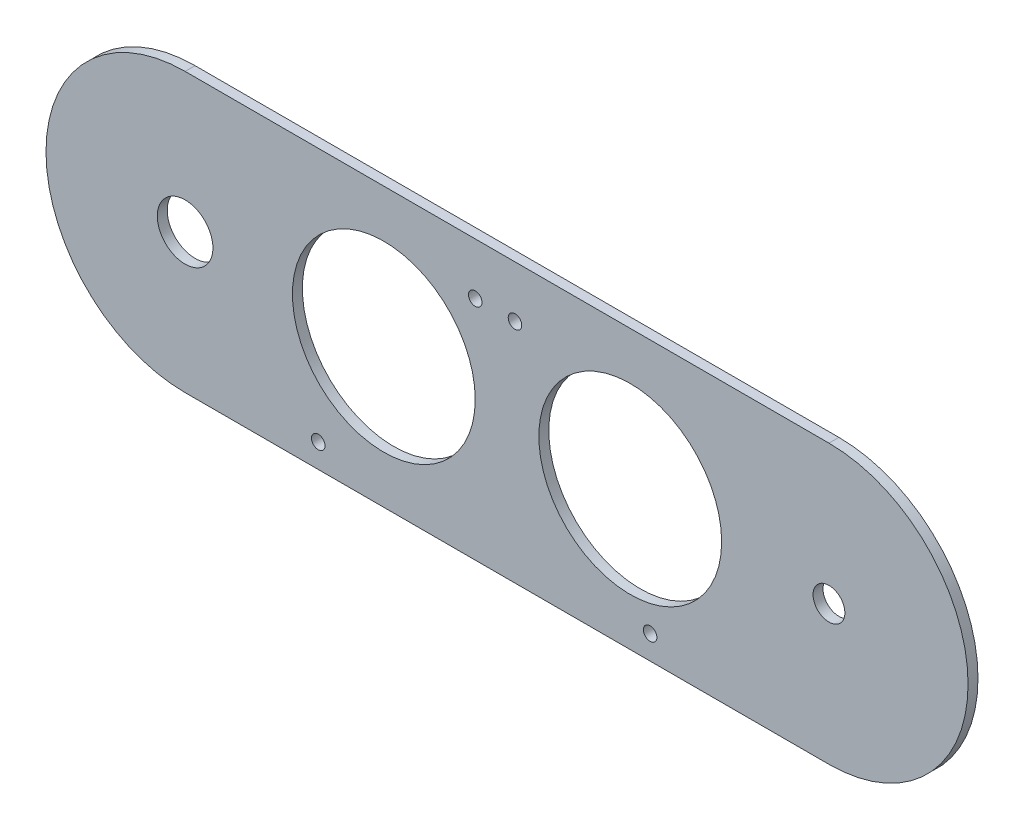
ISO-10303-21;
HEADER;
FILE_DESCRIPTION(('STEP AP214'),'2;1');
FILE_NAME('part.step','',(''),(''),'','','');
FILE_SCHEMA(('AUTOMOTIVE_DESIGN { 1 0 10303 214 1 1 1 1 }'));
ENDSEC;
DATA;
#1=APPLICATION_CONTEXT('core data for automotive mechanical design processes');
#2=APPLICATION_PROTOCOL_DEFINITION('international standard','automotive_design',2000,#1);
#3=PRODUCT_CONTEXT('',#1,'mechanical');
#4=PRODUCT('Part','Part','',(#3));
#5=PRODUCT_RELATED_PRODUCT_CATEGORY('part','',(#4));
#6=PRODUCT_DEFINITION_FORMATION('','',#4);
#7=PRODUCT_DEFINITION_CONTEXT('part definition',#1,'design');
#8=PRODUCT_DEFINITION('design','',#6,#7);
#9=PRODUCT_DEFINITION_SHAPE('','',#8);
#10=(LENGTH_UNIT() NAMED_UNIT(*) SI_UNIT(.MILLI.,.METRE.));
#11=(NAMED_UNIT(*) PLANE_ANGLE_UNIT() SI_UNIT($,.RADIAN.));
#12=(NAMED_UNIT(*) SI_UNIT($,.STERADIAN.) SOLID_ANGLE_UNIT());
#13=UNCERTAINTY_MEASURE_WITH_UNIT(LENGTH_MEASURE(1.E-05),#10,'distance_accuracy_value','');
#14=(GEOMETRIC_REPRESENTATION_CONTEXT(3) GLOBAL_UNCERTAINTY_ASSIGNED_CONTEXT((#13)) GLOBAL_UNIT_ASSIGNED_CONTEXT((#10,
#11,#12)) REPRESENTATION_CONTEXT('',''));
#15=CARTESIAN_POINT('',(0.,0.,0.));
#16=DIRECTION('',(0.,0.,1.));
#17=DIRECTION('',(1.,0.,0.));
#18=AXIS2_PLACEMENT_3D('',#15,#16,#17);
#19=CARTESIAN_POINT('',(-60.5878311258278,15.0430463576159,2.5));
#20=DIRECTION('',(0.,0.,1.));
#21=DIRECTION('',(1.,0.,0.));
#22=AXIS2_PLACEMENT_3D('',#19,#20,#21);
#23=PLANE('',#22);
#24=CARTESIAN_POINT('',(56.4121688741722,-13.9569536423841,2.5));
#25=DIRECTION('',(0.,0.,1.));
#26=DIRECTION('',(1.,0.,0.));
#27=AXIS2_PLACEMENT_3D('',#24,#25,#26);
#28=CIRCLE('',#27,1.7);
#29=CARTESIAN_POINT('',(58.1121688741722,-13.9569536423841,2.5));
#30=VERTEX_POINT('',#29);
#31=EDGE_CURVE('E172',#30,#30,#28,.T.);
#32=ORIENTED_EDGE('',*,*,#31,.F.);
#33=EDGE_LOOP('',(#32));
#34=FACE_BOUND('',#33,.T.);
#35=CARTESIAN_POINT('',(-27.0878311258278,-13.9569536423841,2.5));
#36=DIRECTION('',(0.,0.,1.));
#37=DIRECTION('',(1.,0.,0.));
#38=AXIS2_PLACEMENT_3D('',#35,#36,#37);
#39=CIRCLE('',#38,1.7);
#40=CARTESIAN_POINT('',(-25.3878311258278,-13.9569536423841,2.5));
#41=VERTEX_POINT('',#40);
#42=EDGE_CURVE('E173',#41,#41,#39,.T.);
#43=ORIENTED_EDGE('',*,*,#42,.F.);
#44=EDGE_LOOP('',(#43));
#45=FACE_BOUND('',#44,.T.);
#46=CARTESIAN_POINT('',(22.4121688741722,37.0430463576159,2.5));
#47=DIRECTION('',(0.,0.,1.));
#48=DIRECTION('',(1.,0.,0.));
#49=AXIS2_PLACEMENT_3D('',#46,#47,#48);
#50=CIRCLE('',#49,1.7);
#51=CARTESIAN_POINT('',(24.1121688741722,37.0430463576159,2.5));
#52=VERTEX_POINT('',#51);
#53=EDGE_CURVE('E185',#52,#52,#50,.T.);
#54=ORIENTED_EDGE('',*,*,#53,.F.);
#55=EDGE_LOOP('',(#54));
#56=FACE_BOUND('',#55,.T.);
#57=CARTESIAN_POINT('',(12.4121688741722,37.0430463576159,2.5));
#58=DIRECTION('',(0.,0.,1.));
#59=DIRECTION('',(1.,0.,0.));
#60=AXIS2_PLACEMENT_3D('',#57,#58,#59);
#61=CIRCLE('',#60,1.7);
#62=CARTESIAN_POINT('',(14.1121688741722,37.0430463576159,2.5));
#63=VERTEX_POINT('',#62);
#64=EDGE_CURVE('E188',#63,#63,#61,.T.);
#65=ORIENTED_EDGE('',*,*,#64,.F.);
#66=EDGE_LOOP('',(#65));
#67=FACE_BOUND('',#66,.T.);
#68=CARTESIAN_POINT('',(51.4121688741722,15.0430463576159,2.5));
#69=DIRECTION('',(0.,0.,1.));
#70=DIRECTION('',(1.,0.,0.));
#71=AXIS2_PLACEMENT_3D('',#68,#69,#70);
#72=CIRCLE('',#71,23.);
#73=CARTESIAN_POINT('',(74.4121688741722,15.0430463576159,2.5));
#74=VERTEX_POINT('',#73);
#75=EDGE_CURVE('E203',#74,#74,#72,.T.);
#76=ORIENTED_EDGE('',*,*,#75,.F.);
#77=EDGE_LOOP('',(#76));
#78=FACE_BOUND('',#77,.T.);
#79=CARTESIAN_POINT('',(-60.5878311258278,15.0430463576159,2.5));
#80=DIRECTION('',(0.,0.,1.));
#81=DIRECTION('',(1.,0.,0.));
#82=AXIS2_PLACEMENT_3D('',#79,#80,#81);
#83=CIRCLE('',#82,7.);
#84=CARTESIAN_POINT('',(-53.5878311258278,15.0430463576159,2.5));
#85=VERTEX_POINT('',#84);
#86=EDGE_CURVE('E94',#85,#85,#83,.T.);
#87=ORIENTED_EDGE('',*,*,#86,.F.);
#88=EDGE_LOOP('',(#87));
#89=FACE_BOUND('',#88,.T.);
#90=CARTESIAN_POINT('',(-60.5878311258278,15.0430463576159,2.5));
#91=DIRECTION('',(0.,0.,1.));
#92=DIRECTION('',(1.,0.,0.));
#93=AXIS2_PLACEMENT_3D('',#90,#91,#92);
#94=CIRCLE('',#93,35.);
#95=CARTESIAN_POINT('',(-60.5878311258278,50.0430463576159,2.5));
#96=VERTEX_POINT('',#95);
#97=CARTESIAN_POINT('',(-60.5878311258278,-19.9569536423841,2.5));
#98=VERTEX_POINT('',#97);
#99=EDGE_CURVE('E104',#96,#98,#94,.T.);
#100=ORIENTED_EDGE('',*,*,#99,.T.);
#101=DIRECTION('',(1.,0.,0.));
#102=VECTOR('',#101,1.);
#103=CARTESIAN_POINT('',(-60.5878311258278,-19.9569536423841,2.5));
#104=LINE('',#103,#102);
#105=CARTESIAN_POINT('',(101.412168874172,-19.9569536423841,2.5));
#106=VERTEX_POINT('',#105);
#107=EDGE_CURVE('E91',#98,#106,#104,.T.);
#108=ORIENTED_EDGE('',*,*,#107,.T.);
#109=CARTESIAN_POINT('',(101.412168874172,15.0430463576159,2.5));
#110=DIRECTION('',(0.,0.,-1.));
#111=DIRECTION('',(-1.,0.,0.));
#112=AXIS2_PLACEMENT_3D('',#109,#110,#111);
#113=CIRCLE('',#112,35.);
#114=CARTESIAN_POINT('',(101.412168874172,50.0430463576159,2.5));
#115=VERTEX_POINT('',#114);
#116=EDGE_CURVE('E107',#115,#106,#113,.T.);
#117=ORIENTED_EDGE('',*,*,#116,.F.);
#118=DIRECTION('',(1.,0.,0.));
#119=VECTOR('',#118,1.);
#120=CARTESIAN_POINT('',(-60.5878311258278,50.0430463576159,2.5));
#121=LINE('',#120,#119);
#122=EDGE_CURVE('E109',#96,#115,#121,.T.);
#123=ORIENTED_EDGE('',*,*,#122,.F.);
#124=EDGE_LOOP('',(#100,#108,#117,#123));
#125=FACE_BOUND('',#124,.T.);
#126=CARTESIAN_POINT('',(101.412168874172,15.0430463576159,2.5));
#127=DIRECTION('',(0.,0.,1.));
#128=DIRECTION('',(1.,0.,0.));
#129=AXIS2_PLACEMENT_3D('',#126,#127,#128);
#130=CIRCLE('',#129,4.00000000000001);
#131=CARTESIAN_POINT('',(105.412168874172,15.0430463576159,2.5));
#132=VERTEX_POINT('',#131);
#133=EDGE_CURVE('E209',#132,#132,#130,.T.);
#134=ORIENTED_EDGE('',*,*,#133,.F.);
#135=EDGE_LOOP('',(#134));
#136=FACE_BOUND('',#135,.T.);
#137=CARTESIAN_POINT('',(-10.5878311258278,15.0430463576159,2.5));
#138=DIRECTION('',(0.,0.,1.));
#139=DIRECTION('',(1.,0.,0.));
#140=AXIS2_PLACEMENT_3D('',#137,#138,#139);
#141=CIRCLE('',#140,23.);
#142=CARTESIAN_POINT('',(12.4121688741722,15.0430463576159,2.5));
#143=VERTEX_POINT('',#142);
#144=EDGE_CURVE('E197',#143,#143,#141,.T.);
#145=ORIENTED_EDGE('',*,*,#144,.F.);
#146=EDGE_LOOP('',(#145));
#147=FACE_BOUND('',#146,.T.);
#148=ADVANCED_FACE('F35',(#34,#45,#56,#67,#78,#89,#125,#136,#147),#23,.T.);
#149=CARTESIAN_POINT('',(-60.5878311258278,15.0430463576159,0.));
#150=DIRECTION('',(0.,0.,1.));
#151=DIRECTION('',(1.,0.,0.));
#152=AXIS2_PLACEMENT_3D('',#149,#150,#151);
#153=PLANE('',#152);
#154=CARTESIAN_POINT('',(56.4121688741722,-13.9569536423841,0.));
#155=DIRECTION('',(0.,0.,1.));
#156=DIRECTION('',(1.,0.,0.));
#157=AXIS2_PLACEMENT_3D('',#154,#155,#156);
#158=CIRCLE('',#157,1.7);
#159=CARTESIAN_POINT('',(58.1121688741722,-13.9569536423841,0.));
#160=VERTEX_POINT('',#159);
#161=EDGE_CURVE('E170',#160,#160,#158,.T.);
#162=ORIENTED_EDGE('',*,*,#161,.T.);
#163=EDGE_LOOP('',(#162));
#164=FACE_BOUND('',#163,.T.);
#165=CARTESIAN_POINT('',(-27.0878311258278,-13.9569536423841,0.));
#166=DIRECTION('',(0.,0.,1.));
#167=DIRECTION('',(1.,0.,0.));
#168=AXIS2_PLACEMENT_3D('',#165,#166,#167);
#169=CIRCLE('',#168,1.7);
#170=CARTESIAN_POINT('',(-25.3878311258278,-13.9569536423841,0.));
#171=VERTEX_POINT('',#170);
#172=EDGE_CURVE('E176',#171,#171,#169,.T.);
#173=ORIENTED_EDGE('',*,*,#172,.T.);
#174=EDGE_LOOP('',(#173));
#175=FACE_BOUND('',#174,.T.);
#176=CARTESIAN_POINT('',(22.4121688741722,37.0430463576159,0.));
#177=DIRECTION('',(0.,0.,1.));
#178=DIRECTION('',(1.,0.,0.));
#179=AXIS2_PLACEMENT_3D('',#176,#177,#178);
#180=CIRCLE('',#179,1.7);
#181=CARTESIAN_POINT('',(24.1121688741722,37.0430463576159,0.));
#182=VERTEX_POINT('',#181);
#183=EDGE_CURVE('E182',#182,#182,#180,.T.);
#184=ORIENTED_EDGE('',*,*,#183,.T.);
#185=EDGE_LOOP('',(#184));
#186=FACE_BOUND('',#185,.T.);
#187=CARTESIAN_POINT('',(12.4121688741722,37.0430463576159,0.));
#188=DIRECTION('',(0.,0.,1.));
#189=DIRECTION('',(1.,0.,0.));
#190=AXIS2_PLACEMENT_3D('',#187,#188,#189);
#191=CIRCLE('',#190,1.7);
#192=CARTESIAN_POINT('',(14.1121688741722,37.0430463576159,0.));
#193=VERTEX_POINT('',#192);
#194=EDGE_CURVE('E191',#193,#193,#191,.T.);
#195=ORIENTED_EDGE('',*,*,#194,.T.);
#196=EDGE_LOOP('',(#195));
#197=FACE_BOUND('',#196,.T.);
#198=CARTESIAN_POINT('',(51.4121688741722,15.0430463576159,0.));
#199=DIRECTION('',(0.,0.,1.));
#200=DIRECTION('',(1.,0.,0.));
#201=AXIS2_PLACEMENT_3D('',#198,#199,#200);
#202=CIRCLE('',#201,23.);
#203=CARTESIAN_POINT('',(74.4121688741722,15.0430463576159,0.));
#204=VERTEX_POINT('',#203);
#205=EDGE_CURVE('E200',#204,#204,#202,.T.);
#206=ORIENTED_EDGE('',*,*,#205,.T.);
#207=EDGE_LOOP('',(#206));
#208=FACE_BOUND('',#207,.T.);
#209=CARTESIAN_POINT('',(-60.5878311258278,15.0430463576159,0.));
#210=DIRECTION('',(0.,0.,1.));
#211=DIRECTION('',(1.,0.,0.));
#212=AXIS2_PLACEMENT_3D('',#209,#210,#211);
#213=CIRCLE('',#212,7.);
#214=CARTESIAN_POINT('',(-53.5878311258278,15.0430463576159,0.));
#215=VERTEX_POINT('',#214);
#216=EDGE_CURVE('E97',#215,#215,#213,.T.);
#217=ORIENTED_EDGE('',*,*,#216,.T.);
#218=EDGE_LOOP('',(#217));
#219=FACE_BOUND('',#218,.T.);
#220=CARTESIAN_POINT('',(-60.5878311258278,15.0430463576159,0.));
#221=DIRECTION('',(0.,0.,1.));
#222=DIRECTION('',(1.,0.,0.));
#223=AXIS2_PLACEMENT_3D('',#220,#221,#222);
#224=CIRCLE('',#223,35.);
#225=CARTESIAN_POINT('',(-60.5878311258278,50.0430463576159,0.));
#226=VERTEX_POINT('',#225);
#227=CARTESIAN_POINT('',(-60.5878311258278,-19.9569536423841,0.));
#228=VERTEX_POINT('',#227);
#229=EDGE_CURVE('E84',#226,#228,#224,.T.);
#230=ORIENTED_EDGE('',*,*,#229,.F.);
#231=DIRECTION('',(1.,0.,0.));
#232=VECTOR('',#231,1.);
#233=CARTESIAN_POINT('',(-60.5878311258278,50.0430463576159,0.));
#234=LINE('',#233,#232);
#235=CARTESIAN_POINT('',(101.412168874172,50.0430463576159,0.));
#236=VERTEX_POINT('',#235);
#237=EDGE_CURVE('E102',#226,#236,#234,.T.);
#238=ORIENTED_EDGE('',*,*,#237,.T.);
#239=CARTESIAN_POINT('',(101.412168874172,15.0430463576159,0.));
#240=DIRECTION('',(0.,0.,-1.));
#241=DIRECTION('',(-1.,0.,0.));
#242=AXIS2_PLACEMENT_3D('',#239,#240,#241);
#243=CIRCLE('',#242,35.);
#244=CARTESIAN_POINT('',(101.412168874172,-19.9569536423841,0.));
#245=VERTEX_POINT('',#244);
#246=EDGE_CURVE('E85',#236,#245,#243,.T.);
#247=ORIENTED_EDGE('',*,*,#246,.T.);
#248=DIRECTION('',(1.,0.,0.));
#249=VECTOR('',#248,1.);
#250=CARTESIAN_POINT('',(-60.5878311258278,-19.9569536423841,0.));
#251=LINE('',#250,#249);
#252=EDGE_CURVE('E79',#228,#245,#251,.T.);
#253=ORIENTED_EDGE('',*,*,#252,.F.);
#254=EDGE_LOOP('',(#230,#238,#247,#253));
#255=FACE_BOUND('',#254,.T.);
#256=CARTESIAN_POINT('',(101.412168874172,15.0430463576159,0.));
#257=DIRECTION('',(0.,0.,1.));
#258=DIRECTION('',(1.,0.,0.));
#259=AXIS2_PLACEMENT_3D('',#256,#257,#258);
#260=CIRCLE('',#259,4.00000000000001);
#261=CARTESIAN_POINT('',(105.412168874172,15.0430463576159,0.));
#262=VERTEX_POINT('',#261);
#263=EDGE_CURVE('E206',#262,#262,#260,.T.);
#264=ORIENTED_EDGE('',*,*,#263,.T.);
#265=EDGE_LOOP('',(#264));
#266=FACE_BOUND('',#265,.T.);
#267=CARTESIAN_POINT('',(-10.5878311258278,15.0430463576159,0.));
#268=DIRECTION('',(0.,0.,1.));
#269=DIRECTION('',(1.,0.,0.));
#270=AXIS2_PLACEMENT_3D('',#267,#268,#269);
#271=CIRCLE('',#270,23.);
#272=CARTESIAN_POINT('',(12.4121688741722,15.0430463576159,0.));
#273=VERTEX_POINT('',#272);
#274=EDGE_CURVE('E194',#273,#273,#271,.T.);
#275=ORIENTED_EDGE('',*,*,#274,.T.);
#276=EDGE_LOOP('',(#275));
#277=FACE_BOUND('',#276,.T.);
#278=ADVANCED_FACE('F80',(#164,#175,#186,#197,#208,#219,#255,#266,#277),#153,.F.);
#279=CARTESIAN_POINT('',(-60.5878311258278,15.0430463576159,2.5));
#280=DIRECTION('',(0.,0.,-1.));
#281=DIRECTION('',(-1.,0.,0.));
#282=AXIS2_PLACEMENT_3D('',#279,#280,#281);
#283=CYLINDRICAL_SURFACE('',#282,35.);
#284=ORIENTED_EDGE('',*,*,#229,.T.);
#285=DIRECTION('',(0.,0.,-1.));
#286=VECTOR('',#285,1.);
#287=CARTESIAN_POINT('',(-60.5878311258278,-19.9569536423841,2.5));
#288=LINE('',#287,#286);
#289=EDGE_CURVE('E11',#98,#228,#288,.T.);
#290=ORIENTED_EDGE('',*,*,#289,.F.);
#291=ORIENTED_EDGE('',*,*,#99,.F.);
#292=DIRECTION('',(0.,0.,-1.));
#293=VECTOR('',#292,1.);
#294=CARTESIAN_POINT('',(-60.5878311258278,50.0430463576159,2.5));
#295=LINE('',#294,#293);
#296=EDGE_CURVE('E50',#96,#226,#295,.T.);
#297=ORIENTED_EDGE('',*,*,#296,.T.);
#298=EDGE_LOOP('',(#284,#290,#291,#297));
#299=FACE_BOUND('',#298,.T.);
#300=ADVANCED_FACE('F37',(#299),#283,.T.);
#301=CARTESIAN_POINT('',(-60.5878311258278,-19.9569536423841,2.5));
#302=DIRECTION('',(0.,1.,0.));
#303=DIRECTION('',(0.,0.,1.));
#304=AXIS2_PLACEMENT_3D('',#301,#302,#303);
#305=PLANE('',#304);
#306=ORIENTED_EDGE('',*,*,#252,.T.);
#307=DIRECTION('',(0.,0.,-1.));
#308=VECTOR('',#307,1.);
#309=CARTESIAN_POINT('',(101.412168874172,-19.9569536423841,2.5));
#310=LINE('',#309,#308);
#311=EDGE_CURVE('E43',#106,#245,#310,.T.);
#312=ORIENTED_EDGE('',*,*,#311,.F.);
#313=ORIENTED_EDGE('',*,*,#107,.F.);
#314=ORIENTED_EDGE('',*,*,#289,.T.);
#315=EDGE_LOOP('',(#306,#312,#313,#314));
#316=FACE_BOUND('',#315,.T.);
#317=ADVANCED_FACE('F90',(#316),#305,.F.);
#318=CARTESIAN_POINT('',(101.412168874172,15.0430463576159,2.5));
#319=DIRECTION('',(0.,0.,-1.));
#320=DIRECTION('',(-1.,0.,0.));
#321=AXIS2_PLACEMENT_3D('',#318,#319,#320);
#322=CYLINDRICAL_SURFACE('',#321,35.);
#323=ORIENTED_EDGE('',*,*,#246,.F.);
#324=DIRECTION('',(0.,0.,-1.));
#325=VECTOR('',#324,1.);
#326=CARTESIAN_POINT('',(101.412168874172,50.0430463576159,2.5));
#327=LINE('',#326,#325);
#328=EDGE_CURVE('E58',#115,#236,#327,.T.);
#329=ORIENTED_EDGE('',*,*,#328,.F.);
#330=ORIENTED_EDGE('',*,*,#116,.T.);
#331=ORIENTED_EDGE('',*,*,#311,.T.);
#332=EDGE_LOOP('',(#323,#329,#330,#331));
#333=FACE_BOUND('',#332,.T.);
#334=ADVANCED_FACE('F112',(#333),#322,.T.);
#335=CARTESIAN_POINT('',(-60.5878311258278,50.0430463576159,2.5));
#336=DIRECTION('',(0.,1.,0.));
#337=DIRECTION('',(0.,0.,1.));
#338=AXIS2_PLACEMENT_3D('',#335,#336,#337);
#339=PLANE('',#338);
#340=ORIENTED_EDGE('',*,*,#237,.F.);
#341=ORIENTED_EDGE('',*,*,#296,.F.);
#342=ORIENTED_EDGE('',*,*,#122,.T.);
#343=ORIENTED_EDGE('',*,*,#328,.T.);
#344=EDGE_LOOP('',(#340,#341,#342,#343));
#345=FACE_BOUND('',#344,.T.);
#346=ADVANCED_FACE('F116',(#345),#339,.T.);
#347=CARTESIAN_POINT('',(-60.5878311258278,15.0430463576159,2.5));
#348=DIRECTION('',(0.,0.,-1.));
#349=DIRECTION('',(-1.,0.,0.));
#350=AXIS2_PLACEMENT_3D('',#347,#348,#349);
#351=CYLINDRICAL_SURFACE('',#350,7.);
#352=ORIENTED_EDGE('',*,*,#86,.T.);
#353=EDGE_LOOP('',(#352));
#354=FACE_BOUND('',#353,.T.);
#355=ORIENTED_EDGE('',*,*,#216,.F.);
#356=EDGE_LOOP('',(#355));
#357=FACE_BOUND('',#356,.T.);
#358=ADVANCED_FACE('F118',(#354,#357),#351,.F.);
#359=CARTESIAN_POINT('',(101.412168874172,15.0430463576159,2.5));
#360=DIRECTION('',(0.,0.,-1.));
#361=DIRECTION('',(-1.,0.,0.));
#362=AXIS2_PLACEMENT_3D('',#359,#360,#361);
#363=CYLINDRICAL_SURFACE('',#362,4.00000000000001);
#364=ORIENTED_EDGE('',*,*,#133,.T.);
#365=EDGE_LOOP('',(#364));
#366=FACE_BOUND('',#365,.T.);
#367=ORIENTED_EDGE('',*,*,#263,.F.);
#368=EDGE_LOOP('',(#367));
#369=FACE_BOUND('',#368,.T.);
#370=ADVANCED_FACE('F124',(#366,#369),#363,.F.);
#371=CARTESIAN_POINT('',(51.4121688741722,15.0430463576159,2.5));
#372=DIRECTION('',(0.,0.,-1.));
#373=DIRECTION('',(-1.,0.,0.));
#374=AXIS2_PLACEMENT_3D('',#371,#372,#373);
#375=CYLINDRICAL_SURFACE('',#374,23.);
#376=ORIENTED_EDGE('',*,*,#75,.T.);
#377=EDGE_LOOP('',(#376));
#378=FACE_BOUND('',#377,.T.);
#379=ORIENTED_EDGE('',*,*,#205,.F.);
#380=EDGE_LOOP('',(#379));
#381=FACE_BOUND('',#380,.T.);
#382=ADVANCED_FACE('F141',(#378,#381),#375,.F.);
#383=CARTESIAN_POINT('',(-10.5878311258278,15.0430463576159,2.5));
#384=DIRECTION('',(0.,0.,-1.));
#385=DIRECTION('',(-1.,0.,0.));
#386=AXIS2_PLACEMENT_3D('',#383,#384,#385);
#387=CYLINDRICAL_SURFACE('',#386,23.);
#388=ORIENTED_EDGE('',*,*,#144,.T.);
#389=EDGE_LOOP('',(#388));
#390=FACE_BOUND('',#389,.T.);
#391=ORIENTED_EDGE('',*,*,#274,.F.);
#392=EDGE_LOOP('',(#391));
#393=FACE_BOUND('',#392,.T.);
#394=ADVANCED_FACE('F145',(#390,#393),#387,.F.);
#395=CARTESIAN_POINT('',(12.4121688741722,37.0430463576159,0.));
#396=DIRECTION('',(0.,0.,1.));
#397=DIRECTION('',(1.,0.,0.));
#398=AXIS2_PLACEMENT_3D('',#395,#396,#397);
#399=CYLINDRICAL_SURFACE('',#398,1.7);
#400=ORIENTED_EDGE('',*,*,#194,.F.);
#401=EDGE_LOOP('',(#400));
#402=FACE_BOUND('',#401,.T.);
#403=ORIENTED_EDGE('',*,*,#64,.T.);
#404=EDGE_LOOP('',(#403));
#405=FACE_BOUND('',#404,.T.);
#406=ADVANCED_FACE('F149',(#402,#405),#399,.F.);
#407=CARTESIAN_POINT('',(22.4121688741722,37.0430463576159,0.));
#408=DIRECTION('',(0.,0.,1.));
#409=DIRECTION('',(1.,0.,0.));
#410=AXIS2_PLACEMENT_3D('',#407,#408,#409);
#411=CYLINDRICAL_SURFACE('',#410,1.7);
#412=ORIENTED_EDGE('',*,*,#183,.F.);
#413=EDGE_LOOP('',(#412));
#414=FACE_BOUND('',#413,.T.);
#415=ORIENTED_EDGE('',*,*,#53,.T.);
#416=EDGE_LOOP('',(#415));
#417=FACE_BOUND('',#416,.T.);
#418=ADVANCED_FACE('F153',(#414,#417),#411,.F.);
#419=CARTESIAN_POINT('',(-27.0878311258278,-13.9569536423841,0.));
#420=DIRECTION('',(0.,0.,1.));
#421=DIRECTION('',(1.,0.,0.));
#422=AXIS2_PLACEMENT_3D('',#419,#420,#421);
#423=CYLINDRICAL_SURFACE('',#422,1.7);
#424=ORIENTED_EDGE('',*,*,#172,.F.);
#425=EDGE_LOOP('',(#424));
#426=FACE_BOUND('',#425,.T.);
#427=ORIENTED_EDGE('',*,*,#42,.T.);
#428=EDGE_LOOP('',(#427));
#429=FACE_BOUND('',#428,.T.);
#430=ADVANCED_FACE('F157',(#426,#429),#423,.F.);
#431=CARTESIAN_POINT('',(56.4121688741722,-13.9569536423841,0.));
#432=DIRECTION('',(0.,0.,1.));
#433=DIRECTION('',(1.,0.,0.));
#434=AXIS2_PLACEMENT_3D('',#431,#432,#433);
#435=CYLINDRICAL_SURFACE('',#434,1.7);
#436=ORIENTED_EDGE('',*,*,#161,.F.);
#437=EDGE_LOOP('',(#436));
#438=FACE_BOUND('',#437,.T.);
#439=ORIENTED_EDGE('',*,*,#31,.T.);
#440=EDGE_LOOP('',(#439));
#441=FACE_BOUND('',#440,.T.);
#442=ADVANCED_FACE('F161',(#438,#441),#435,.F.);
#443=CLOSED_SHELL('',(#148,#278,#300,#317,#334,#346,#358,#370,#382,#394,#406,#418,#430,#442));
#444=MANIFOLD_SOLID_BREP('B2',#443);
#445=ADVANCED_BREP_SHAPE_REPRESENTATION('',(#18,#444),#14);
#446=SHAPE_DEFINITION_REPRESENTATION(#9,#445);
ENDSEC;
END-ISO-10303-21;
